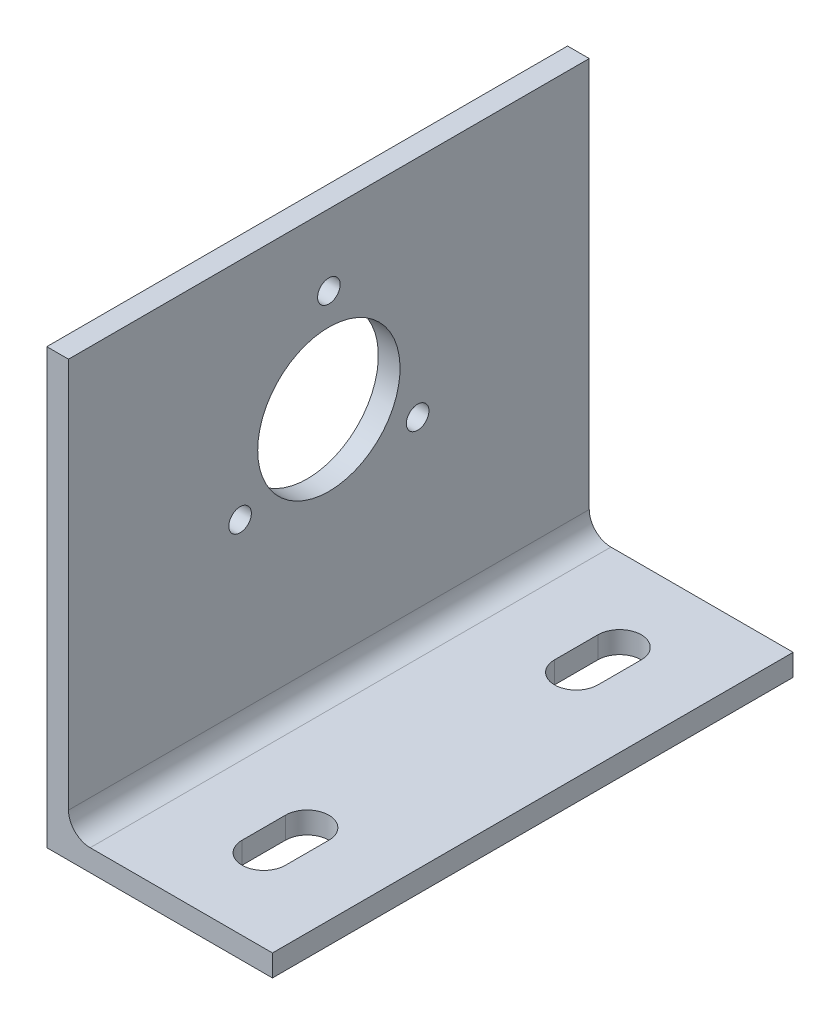
ISO-10303-21;
HEADER;
FILE_DESCRIPTION(('STEP AP214'),'2;1');
FILE_NAME('part.step','',(''),(''),'','','');
FILE_SCHEMA(('AUTOMOTIVE_DESIGN { 1 0 10303 214 1 1 1 1 }'));
ENDSEC;
DATA;
#1=APPLICATION_CONTEXT('core data for automotive mechanical design processes');
#2=APPLICATION_PROTOCOL_DEFINITION('international standard','automotive_design',2000,#1);
#3=PRODUCT_CONTEXT('',#1,'mechanical');
#4=PRODUCT('Part','Part','',(#3));
#5=PRODUCT_RELATED_PRODUCT_CATEGORY('part','',(#4));
#6=PRODUCT_DEFINITION_FORMATION('','',#4);
#7=PRODUCT_DEFINITION_CONTEXT('part definition',#1,'design');
#8=PRODUCT_DEFINITION('design','',#6,#7);
#9=PRODUCT_DEFINITION_SHAPE('','',#8);
#10=(LENGTH_UNIT() NAMED_UNIT(*) SI_UNIT(.MILLI.,.METRE.));
#11=(NAMED_UNIT(*) PLANE_ANGLE_UNIT() SI_UNIT($,.RADIAN.));
#12=(NAMED_UNIT(*) SI_UNIT($,.STERADIAN.) SOLID_ANGLE_UNIT());
#13=UNCERTAINTY_MEASURE_WITH_UNIT(LENGTH_MEASURE(1.E-05),#10,'distance_accuracy_value','');
#14=(GEOMETRIC_REPRESENTATION_CONTEXT(3) GLOBAL_UNCERTAINTY_ASSIGNED_CONTEXT((#13)) GLOBAL_UNIT_ASSIGNED_CONTEXT((#10,
#11,#12)) REPRESENTATION_CONTEXT('',''));
#15=CARTESIAN_POINT('',(0.,0.,0.));
#16=DIRECTION('',(0.,0.,1.));
#17=DIRECTION('',(1.,0.,0.));
#18=AXIS2_PLACEMENT_3D('',#15,#16,#17);
#19=CARTESIAN_POINT('',(101.6,0.,76.2));
#20=DIRECTION('',(0.,1.,0.));
#21=DIRECTION('',(-1.,0.,0.));
#22=AXIS2_PLACEMENT_3D('',#19,#20,#21);
#23=PLANE('',#22);
#24=DIRECTION('',(0.,0.,-1.));
#25=VECTOR('',#24,1.);
#26=CARTESIAN_POINT('',(22.86,0.,12.065));
#27=LINE('',#26,#25);
#28=CARTESIAN_POINT('',(22.86,0.,18.415));
#29=VERTEX_POINT('',#28);
#30=CARTESIAN_POINT('',(22.86,0.,12.065));
#31=VERTEX_POINT('',#30);
#32=EDGE_CURVE('E161',#29,#31,#27,.T.);
#33=ORIENTED_EDGE('',*,*,#32,.T.);
#34=CARTESIAN_POINT('',(19.685,0.,12.065));
#35=DIRECTION('',(0.,1.,0.));
#36=DIRECTION('',(0.,0.,1.));
#37=AXIS2_PLACEMENT_3D('',#34,#35,#36);
#38=CIRCLE('',#37,3.17500000000001);
#39=CARTESIAN_POINT('',(16.51,0.,12.065));
#40=VERTEX_POINT('',#39);
#41=EDGE_CURVE('E152',#31,#40,#38,.T.);
#42=ORIENTED_EDGE('',*,*,#41,.T.);
#43=DIRECTION('',(0.,0.,1.));
#44=VECTOR('',#43,1.);
#45=CARTESIAN_POINT('',(16.51,0.,12.065));
#46=LINE('',#45,#44);
#47=CARTESIAN_POINT('',(16.51,0.,18.415));
#48=VERTEX_POINT('',#47);
#49=EDGE_CURVE('E164',#40,#48,#46,.T.);
#50=ORIENTED_EDGE('',*,*,#49,.T.);
#51=CARTESIAN_POINT('',(19.685,0.,18.415));
#52=DIRECTION('',(0.,1.,0.));
#53=DIRECTION('',(0.,0.,1.));
#54=AXIS2_PLACEMENT_3D('',#51,#52,#53);
#55=CIRCLE('',#54,3.17500000000001);
#56=EDGE_CURVE('E57',#48,#29,#55,.T.);
#57=ORIENTED_EDGE('',*,*,#56,.T.);
#58=EDGE_LOOP('',(#33,#42,#50,#57));
#59=FACE_BOUND('',#58,.T.);
#60=DIRECTION('',(0.,0.,1.));
#61=VECTOR('',#60,1.);
#62=CARTESIAN_POINT('',(16.51,0.,64.135));
#63=LINE('',#62,#61);
#64=CARTESIAN_POINT('',(16.51,0.,57.785));
#65=VERTEX_POINT('',#64);
#66=CARTESIAN_POINT('',(16.51,0.,64.135));
#67=VERTEX_POINT('',#66);
#68=EDGE_CURVE('E206',#65,#67,#63,.T.);
#69=ORIENTED_EDGE('',*,*,#68,.T.);
#70=CARTESIAN_POINT('',(19.685,0.,64.135));
#71=DIRECTION('',(0.,1.,0.));
#72=DIRECTION('',(0.,0.,-1.));
#73=AXIS2_PLACEMENT_3D('',#70,#71,#72);
#74=CIRCLE('',#73,3.17500000000001);
#75=CARTESIAN_POINT('',(22.86,0.,64.135));
#76=VERTEX_POINT('',#75);
#77=EDGE_CURVE('E221',#67,#76,#74,.T.);
#78=ORIENTED_EDGE('',*,*,#77,.T.);
#79=DIRECTION('',(0.,0.,-1.));
#80=VECTOR('',#79,1.);
#81=CARTESIAN_POINT('',(22.86,0.,64.135));
#82=LINE('',#81,#80);
#83=CARTESIAN_POINT('',(22.86,0.,57.785));
#84=VERTEX_POINT('',#83);
#85=EDGE_CURVE('E236',#76,#84,#82,.T.);
#86=ORIENTED_EDGE('',*,*,#85,.T.);
#87=CARTESIAN_POINT('',(19.685,0.,57.785));
#88=DIRECTION('',(0.,1.,0.));
#89=DIRECTION('',(0.,0.,-1.));
#90=AXIS2_PLACEMENT_3D('',#87,#88,#89);
#91=CIRCLE('',#90,3.17500000000001);
#92=EDGE_CURVE('E65',#84,#65,#91,.T.);
#93=ORIENTED_EDGE('',*,*,#92,.T.);
#94=EDGE_LOOP('',(#69,#78,#86,#93));
#95=FACE_BOUND('',#94,.T.);
#96=DIRECTION('',(1.,0.,0.));
#97=VECTOR('',#96,1.);
#98=CARTESIAN_POINT('',(101.6,0.,0.));
#99=LINE('',#98,#97);
#100=CARTESIAN_POINT('',(0.,0.,0.));
#101=VERTEX_POINT('',#100);
#102=CARTESIAN_POINT('',(33.02,0.,0.));
#103=VERTEX_POINT('',#102);
#104=EDGE_CURVE('E288',#101,#103,#99,.T.);
#105=ORIENTED_EDGE('',*,*,#104,.T.);
#106=DIRECTION('',(0.,0.,1.));
#107=VECTOR('',#106,1.);
#108=CARTESIAN_POINT('',(33.02,0.,0.));
#109=LINE('',#108,#107);
#110=CARTESIAN_POINT('',(33.02,0.,76.2));
#111=VERTEX_POINT('',#110);
#112=EDGE_CURVE('E243',#103,#111,#109,.T.);
#113=ORIENTED_EDGE('',*,*,#112,.T.);
#114=DIRECTION('',(1.,0.,0.));
#115=VECTOR('',#114,1.);
#116=CARTESIAN_POINT('',(101.6,0.,76.2));
#117=LINE('',#116,#115);
#118=CARTESIAN_POINT('',(0.,0.,76.2));
#119=VERTEX_POINT('',#118);
#120=EDGE_CURVE('E289',#119,#111,#117,.T.);
#121=ORIENTED_EDGE('',*,*,#120,.F.);
#122=DIRECTION('',(0.,0.,-1.));
#123=VECTOR('',#122,1.);
#124=CARTESIAN_POINT('',(0.,0.,76.2));
#125=LINE('',#124,#123);
#126=EDGE_CURVE('E306',#119,#101,#125,.T.);
#127=ORIENTED_EDGE('',*,*,#126,.T.);
#128=EDGE_LOOP('',(#105,#113,#121,#127));
#129=FACE_BOUND('',#128,.T.);
#130=ADVANCED_FACE('F41',(#59,#95,#129),#23,.F.);
#131=CARTESIAN_POINT('',(3.17500000000001,3.17499999999999,76.2));
#132=DIRECTION('',(0.,-1.,0.));
#133=DIRECTION('',(1.,0.,0.));
#134=AXIS2_PLACEMENT_3D('',#131,#132,#133);
#135=PLANE('',#134);
#136=DIRECTION('',(0.,0.,1.));
#137=VECTOR('',#136,1.);
#138=CARTESIAN_POINT('',(16.51,3.17499999999999,12.065));
#139=LINE('',#138,#137);
#140=CARTESIAN_POINT('',(16.51,3.17499999999999,12.065));
#141=VERTEX_POINT('',#140);
#142=CARTESIAN_POINT('',(16.51,3.17499999999999,18.415));
#143=VERTEX_POINT('',#142);
#144=EDGE_CURVE('E186',#141,#143,#139,.T.);
#145=ORIENTED_EDGE('',*,*,#144,.F.);
#146=CARTESIAN_POINT('',(19.685,3.17499999999999,12.065));
#147=DIRECTION('',(0.,1.,0.));
#148=DIRECTION('',(0.,0.,1.));
#149=AXIS2_PLACEMENT_3D('',#146,#147,#148);
#150=CIRCLE('',#149,3.17500000000001);
#151=CARTESIAN_POINT('',(22.86,3.17499999999999,12.065));
#152=VERTEX_POINT('',#151);
#153=EDGE_CURVE('E155',#152,#141,#150,.T.);
#154=ORIENTED_EDGE('',*,*,#153,.F.);
#155=DIRECTION('',(0.,0.,-1.));
#156=VECTOR('',#155,1.);
#157=CARTESIAN_POINT('',(22.86,3.17499999999999,12.065));
#158=LINE('',#157,#156);
#159=CARTESIAN_POINT('',(22.86,3.17499999999999,18.415));
#160=VERTEX_POINT('',#159);
#161=EDGE_CURVE('E172',#160,#152,#158,.T.);
#162=ORIENTED_EDGE('',*,*,#161,.F.);
#163=CARTESIAN_POINT('',(19.685,3.17499999999999,18.415));
#164=DIRECTION('',(0.,1.,0.));
#165=DIRECTION('',(0.,0.,1.));
#166=AXIS2_PLACEMENT_3D('',#163,#164,#165);
#167=CIRCLE('',#166,3.17500000000001);
#168=EDGE_CURVE('E177',#143,#160,#167,.T.);
#169=ORIENTED_EDGE('',*,*,#168,.F.);
#170=EDGE_LOOP('',(#145,#154,#162,#169));
#171=FACE_BOUND('',#170,.T.);
#172=DIRECTION('',(0.,0.,-1.));
#173=VECTOR('',#172,1.);
#174=CARTESIAN_POINT('',(22.86,3.17499999999999,64.135));
#175=LINE('',#174,#173);
#176=CARTESIAN_POINT('',(22.86,3.17499999999999,64.135));
#177=VERTEX_POINT('',#176);
#178=CARTESIAN_POINT('',(22.86,3.17499999999999,57.785));
#179=VERTEX_POINT('',#178);
#180=EDGE_CURVE('E225',#177,#179,#175,.T.);
#181=ORIENTED_EDGE('',*,*,#180,.F.);
#182=CARTESIAN_POINT('',(19.685,3.17499999999999,64.135));
#183=DIRECTION('',(0.,1.,0.));
#184=DIRECTION('',(0.,0.,-1.));
#185=AXIS2_PLACEMENT_3D('',#182,#183,#184);
#186=CIRCLE('',#185,3.17500000000001);
#187=CARTESIAN_POINT('',(16.51,3.17499999999999,64.135));
#188=VERTEX_POINT('',#187);
#189=EDGE_CURVE('E187',#188,#177,#186,.T.);
#190=ORIENTED_EDGE('',*,*,#189,.F.);
#191=DIRECTION('',(0.,0.,1.));
#192=VECTOR('',#191,1.);
#193=CARTESIAN_POINT('',(16.51,3.17499999999999,64.135));
#194=LINE('',#193,#192);
#195=CARTESIAN_POINT('',(16.51,3.17499999999999,57.785));
#196=VERTEX_POINT('',#195);
#197=EDGE_CURVE('E216',#196,#188,#194,.T.);
#198=ORIENTED_EDGE('',*,*,#197,.F.);
#199=CARTESIAN_POINT('',(19.685,3.17499999999999,57.785));
#200=DIRECTION('',(0.,1.,0.));
#201=DIRECTION('',(0.,0.,-1.));
#202=AXIS2_PLACEMENT_3D('',#199,#200,#201);
#203=CIRCLE('',#202,3.17500000000001);
#204=EDGE_CURVE('E220',#179,#196,#203,.T.);
#205=ORIENTED_EDGE('',*,*,#204,.F.);
#206=EDGE_LOOP('',(#181,#190,#198,#205));
#207=FACE_BOUND('',#206,.T.);
#208=DIRECTION('',(-1.,0.,0.));
#209=VECTOR('',#208,1.);
#210=CARTESIAN_POINT('',(3.17500000000001,3.17499999999999,76.2));
#211=LINE('',#210,#209);
#212=CARTESIAN_POINT('',(33.02,3.17499999999999,76.2));
#213=VERTEX_POINT('',#212);
#214=CARTESIAN_POINT('',(6.35000000000001,3.17499999999999,76.2));
#215=VERTEX_POINT('',#214);
#216=EDGE_CURVE('E293',#213,#215,#211,.T.);
#217=ORIENTED_EDGE('',*,*,#216,.F.);
#218=DIRECTION('',(0.,0.,1.));
#219=VECTOR('',#218,1.);
#220=CARTESIAN_POINT('',(33.02,3.17499999999999,0.));
#221=LINE('',#220,#219);
#222=CARTESIAN_POINT('',(33.02,3.17499999999999,0.));
#223=VERTEX_POINT('',#222);
#224=EDGE_CURVE('E196',#223,#213,#221,.T.);
#225=ORIENTED_EDGE('',*,*,#224,.F.);
#226=DIRECTION('',(-1.,0.,0.));
#227=VECTOR('',#226,1.);
#228=CARTESIAN_POINT('',(3.17500000000001,3.17499999999999,0.));
#229=LINE('',#228,#227);
#230=CARTESIAN_POINT('',(6.35000000000001,3.17499999999999,0.));
#231=VERTEX_POINT('',#230);
#232=EDGE_CURVE('E310',#223,#231,#229,.T.);
#233=ORIENTED_EDGE('',*,*,#232,.T.);
#234=DIRECTION('',(0.,0.,-1.));
#235=VECTOR('',#234,1.);
#236=CARTESIAN_POINT('',(6.35000000000001,3.17499999999999,76.2));
#237=LINE('',#236,#235);
#238=EDGE_CURVE('E336',#231,#215,#237,.F.);
#239=ORIENTED_EDGE('',*,*,#238,.T.);
#240=EDGE_LOOP('',(#217,#225,#233,#239));
#241=FACE_BOUND('',#240,.T.);
#242=ADVANCED_FACE('F354',(#171,#207,#241),#135,.F.);
#243=CARTESIAN_POINT('',(3.175,63.5,76.2));
#244=DIRECTION('',(-1.,0.,0.));
#245=DIRECTION('',(0.,-1.,0.));
#246=AXIS2_PLACEMENT_3D('',#243,#244,#245);
#247=PLANE('',#246);
#248=CARTESIAN_POINT('',(3.175,30.6000000000003,51.0903810567672));
#249=DIRECTION('',(-1.,0.,0.));
#250=DIRECTION('',(0.,-1.,0.));
#251=AXIS2_PLACEMENT_3D('',#248,#249,#250);
#252=CIRCLE('',#251,1.65099999999999);
#253=CARTESIAN_POINT('',(3.175,28.9490000000003,51.0903810567672));
#254=VERTEX_POINT('',#253);
#255=EDGE_CURVE('E284',#254,#254,#252,.T.);
#256=ORIENTED_EDGE('',*,*,#255,.T.);
#257=EDGE_LOOP('',(#256));
#258=FACE_BOUND('',#257,.T.);
#259=CARTESIAN_POINT('',(3.175,30.5999999999998,25.109618943234));
#260=DIRECTION('',(-1.,0.,0.));
#261=DIRECTION('',(0.,-1.,0.));
#262=AXIS2_PLACEMENT_3D('',#259,#260,#261);
#263=CIRCLE('',#262,1.651);
#264=CARTESIAN_POINT('',(3.175,28.9489999999997,25.109618943234));
#265=VERTEX_POINT('',#264);
#266=EDGE_CURVE('E280',#265,#265,#263,.T.);
#267=ORIENTED_EDGE('',*,*,#266,.T.);
#268=EDGE_LOOP('',(#267));
#269=FACE_BOUND('',#268,.T.);
#270=CARTESIAN_POINT('',(3.175,53.1,38.1));
#271=DIRECTION('',(-1.,0.,0.));
#272=DIRECTION('',(0.,-1.,0.));
#273=AXIS2_PLACEMENT_3D('',#270,#271,#272);
#274=CIRCLE('',#273,1.651);
#275=CARTESIAN_POINT('',(3.175,51.449,38.1));
#276=VERTEX_POINT('',#275);
#277=EDGE_CURVE('E276',#276,#276,#274,.T.);
#278=ORIENTED_EDGE('',*,*,#277,.T.);
#279=EDGE_LOOP('',(#278));
#280=FACE_BOUND('',#279,.T.);
#281=CARTESIAN_POINT('',(3.175,38.1,38.1));
#282=DIRECTION('',(-1.,0.,0.));
#283=DIRECTION('',(0.,-1.,0.));
#284=AXIS2_PLACEMENT_3D('',#281,#282,#283);
#285=CIRCLE('',#284,10.414);
#286=CARTESIAN_POINT('',(3.175,27.686,38.1));
#287=VERTEX_POINT('',#286);
#288=EDGE_CURVE('E272',#287,#287,#285,.T.);
#289=ORIENTED_EDGE('',*,*,#288,.T.);
#290=EDGE_LOOP('',(#289));
#291=FACE_BOUND('',#290,.T.);
#292=DIRECTION('',(0.,1.,0.));
#293=VECTOR('',#292,1.);
#294=CARTESIAN_POINT('',(3.175,63.5,76.2));
#295=LINE('',#294,#293);
#296=CARTESIAN_POINT('',(3.17500000000001,6.35,76.2));
#297=VERTEX_POINT('',#296);
#298=CARTESIAN_POINT('',(3.175,63.5,76.2));
#299=VERTEX_POINT('',#298);
#300=EDGE_CURVE('E297',#297,#299,#295,.T.);
#301=ORIENTED_EDGE('',*,*,#300,.F.);
#302=DIRECTION('',(0.,0.,-1.));
#303=VECTOR('',#302,1.);
#304=CARTESIAN_POINT('',(3.17500000000001,6.34999999999999,0.));
#305=LINE('',#304,#303);
#306=CARTESIAN_POINT('',(3.17500000000001,6.35,0.));
#307=VERTEX_POINT('',#306);
#308=EDGE_CURVE('E332',#297,#307,#305,.T.);
#309=ORIENTED_EDGE('',*,*,#308,.T.);
#310=DIRECTION('',(0.,1.,0.));
#311=VECTOR('',#310,1.);
#312=CARTESIAN_POINT('',(3.175,63.5,0.));
#313=LINE('',#312,#311);
#314=CARTESIAN_POINT('',(3.175,63.5,0.));
#315=VERTEX_POINT('',#314);
#316=EDGE_CURVE('E313',#307,#315,#313,.T.);
#317=ORIENTED_EDGE('',*,*,#316,.T.);
#318=DIRECTION('',(0.,0.,-1.));
#319=VECTOR('',#318,1.);
#320=CARTESIAN_POINT('',(3.175,63.5,76.2));
#321=LINE('',#320,#319);
#322=EDGE_CURVE('E328',#299,#315,#321,.T.);
#323=ORIENTED_EDGE('',*,*,#322,.F.);
#324=EDGE_LOOP('',(#301,#309,#317,#323));
#325=FACE_BOUND('',#324,.T.);
#326=ADVANCED_FACE('F375',(#258,#269,#280,#291,#325),#247,.F.);
#327=CARTESIAN_POINT('',(0.,63.5,76.2));
#328=DIRECTION('',(0.,-1.,0.));
#329=DIRECTION('',(0.,0.,-1.));
#330=AXIS2_PLACEMENT_3D('',#327,#328,#329);
#331=PLANE('',#330);
#332=DIRECTION('',(-1.,0.,0.));
#333=VECTOR('',#332,1.);
#334=CARTESIAN_POINT('',(0.,63.5,0.));
#335=LINE('',#334,#333);
#336=CARTESIAN_POINT('',(0.,63.5,0.));
#337=VERTEX_POINT('',#336);
#338=EDGE_CURVE('E316',#315,#337,#335,.T.);
#339=ORIENTED_EDGE('',*,*,#338,.T.);
#340=DIRECTION('',(0.,0.,-1.));
#341=VECTOR('',#340,1.);
#342=CARTESIAN_POINT('',(0.,63.5,76.2));
#343=LINE('',#342,#341);
#344=CARTESIAN_POINT('',(0.,63.5,76.2));
#345=VERTEX_POINT('',#344);
#346=EDGE_CURVE('E324',#345,#337,#343,.T.);
#347=ORIENTED_EDGE('',*,*,#346,.F.);
#348=DIRECTION('',(-1.,0.,0.));
#349=VECTOR('',#348,1.);
#350=CARTESIAN_POINT('',(0.,63.5,76.2));
#351=LINE('',#350,#349);
#352=EDGE_CURVE('E300',#299,#345,#351,.T.);
#353=ORIENTED_EDGE('',*,*,#352,.F.);
#354=ORIENTED_EDGE('',*,*,#322,.T.);
#355=EDGE_LOOP('',(#339,#347,#353,#354));
#356=FACE_BOUND('',#355,.T.);
#357=ADVANCED_FACE('F371',(#356),#331,.F.);
#358=CARTESIAN_POINT('',(0.,0.,76.2));
#359=DIRECTION('',(1.,0.,0.));
#360=DIRECTION('',(0.,0.,-1.));
#361=AXIS2_PLACEMENT_3D('',#358,#359,#360);
#362=PLANE('',#361);
#363=CARTESIAN_POINT('',(0.,30.6000000000003,51.0903810567672));
#364=DIRECTION('',(-1.,0.,0.));
#365=DIRECTION('',(0.,0.,1.));
#366=AXIS2_PLACEMENT_3D('',#363,#364,#365);
#367=CIRCLE('',#366,1.65099999999999);
#368=CARTESIAN_POINT('',(0.,30.6000000000003,52.7413810567672));
#369=VERTEX_POINT('',#368);
#370=EDGE_CURVE('E254',#369,#369,#367,.T.);
#371=ORIENTED_EDGE('',*,*,#370,.F.);
#372=EDGE_LOOP('',(#371));
#373=FACE_BOUND('',#372,.T.);
#374=CARTESIAN_POINT('',(0.,30.5999999999998,25.109618943234));
#375=DIRECTION('',(-1.,0.,0.));
#376=DIRECTION('',(0.,0.,1.));
#377=AXIS2_PLACEMENT_3D('',#374,#375,#376);
#378=CIRCLE('',#377,1.651);
#379=CARTESIAN_POINT('',(0.,30.5999999999998,26.760618943234));
#380=VERTEX_POINT('',#379);
#381=EDGE_CURVE('E262',#380,#380,#378,.T.);
#382=ORIENTED_EDGE('',*,*,#381,.F.);
#383=EDGE_LOOP('',(#382));
#384=FACE_BOUND('',#383,.T.);
#385=CARTESIAN_POINT('',(0.,53.1,38.1));
#386=DIRECTION('',(-1.,0.,0.));
#387=DIRECTION('',(0.,0.,1.));
#388=AXIS2_PLACEMENT_3D('',#385,#386,#387);
#389=CIRCLE('',#388,1.651);
#390=CARTESIAN_POINT('',(0.,53.1,39.751));
#391=VERTEX_POINT('',#390);
#392=EDGE_CURVE('E257',#391,#391,#389,.T.);
#393=ORIENTED_EDGE('',*,*,#392,.F.);
#394=EDGE_LOOP('',(#393));
#395=FACE_BOUND('',#394,.T.);
#396=CARTESIAN_POINT('',(0.,38.1,38.1));
#397=DIRECTION('',(-1.,0.,0.));
#398=DIRECTION('',(0.,0.,1.));
#399=AXIS2_PLACEMENT_3D('',#396,#397,#398);
#400=CIRCLE('',#399,10.414);
#401=CARTESIAN_POINT('',(0.,38.1,48.514));
#402=VERTEX_POINT('',#401);
#403=EDGE_CURVE('E261',#402,#402,#400,.T.);
#404=ORIENTED_EDGE('',*,*,#403,.F.);
#405=EDGE_LOOP('',(#404));
#406=FACE_BOUND('',#405,.T.);
#407=DIRECTION('',(0.,-1.,0.));
#408=VECTOR('',#407,1.);
#409=CARTESIAN_POINT('',(0.,0.,0.));
#410=LINE('',#409,#408);
#411=EDGE_CURVE('E294',#337,#101,#410,.T.);
#412=ORIENTED_EDGE('',*,*,#411,.T.);
#413=ORIENTED_EDGE('',*,*,#126,.F.);
#414=DIRECTION('',(0.,-1.,0.));
#415=VECTOR('',#414,1.);
#416=CARTESIAN_POINT('',(0.,0.,76.2));
#417=LINE('',#416,#415);
#418=EDGE_CURVE('E303',#345,#119,#417,.T.);
#419=ORIENTED_EDGE('',*,*,#418,.F.);
#420=ORIENTED_EDGE('',*,*,#346,.T.);
#421=EDGE_LOOP('',(#412,#413,#419,#420));
#422=FACE_BOUND('',#421,.T.);
#423=ADVANCED_FACE('F367',(#373,#384,#395,#406,#422),#362,.F.);
#424=CARTESIAN_POINT('',(0.,0.,76.2));
#425=DIRECTION('',(0.,0.,-1.));
#426=DIRECTION('',(-1.,0.,0.));
#427=AXIS2_PLACEMENT_3D('',#424,#425,#426);
#428=PLANE('',#427);
#429=ORIENTED_EDGE('',*,*,#120,.T.);
#430=DIRECTION('',(0.,1.,0.));
#431=VECTOR('',#430,1.);
#432=CARTESIAN_POINT('',(33.02,0.,76.2));
#433=LINE('',#432,#431);
#434=EDGE_CURVE('E250',#111,#213,#433,.T.);
#435=ORIENTED_EDGE('',*,*,#434,.T.);
#436=ORIENTED_EDGE('',*,*,#216,.T.);
#437=CARTESIAN_POINT('',(6.35000000000001,6.34999999999999,76.2));
#438=DIRECTION('',(0.,0.,-1.));
#439=DIRECTION('',(-1.,0.,0.));
#440=AXIS2_PLACEMENT_3D('',#437,#438,#439);
#441=CIRCLE('',#440,3.175);
#442=EDGE_CURVE('E11',#215,#297,#441,.T.);
#443=ORIENTED_EDGE('',*,*,#442,.T.);
#444=ORIENTED_EDGE('',*,*,#300,.T.);
#445=ORIENTED_EDGE('',*,*,#352,.T.);
#446=ORIENTED_EDGE('',*,*,#418,.T.);
#447=EDGE_LOOP('',(#429,#435,#436,#443,#444,#445,#446));
#448=FACE_BOUND('',#447,.T.);
#449=ADVANCED_FACE('F359',(#448),#428,.F.);
#450=CARTESIAN_POINT('',(0.,0.,0.));
#451=DIRECTION('',(0.,0.,-1.));
#452=DIRECTION('',(-1.,0.,0.));
#453=AXIS2_PLACEMENT_3D('',#450,#451,#452);
#454=PLANE('',#453);
#455=DIRECTION('',(0.,1.,0.));
#456=VECTOR('',#455,1.);
#457=CARTESIAN_POINT('',(33.02,0.,0.));
#458=LINE('',#457,#456);
#459=EDGE_CURVE('E247',#103,#223,#458,.T.);
#460=ORIENTED_EDGE('',*,*,#459,.F.);
#461=ORIENTED_EDGE('',*,*,#104,.F.);
#462=ORIENTED_EDGE('',*,*,#411,.F.);
#463=ORIENTED_EDGE('',*,*,#338,.F.);
#464=ORIENTED_EDGE('',*,*,#316,.F.);
#465=CARTESIAN_POINT('',(6.35000000000001,6.34999999999999,0.));
#466=DIRECTION('',(0.,0.,-1.));
#467=DIRECTION('',(-1.,0.,0.));
#468=AXIS2_PLACEMENT_3D('',#465,#466,#467);
#469=CIRCLE('',#468,3.175);
#470=EDGE_CURVE('E50',#307,#231,#469,.F.);
#471=ORIENTED_EDGE('',*,*,#470,.T.);
#472=ORIENTED_EDGE('',*,*,#232,.F.);
#473=EDGE_LOOP('',(#460,#461,#462,#463,#464,#471,#472));
#474=FACE_BOUND('',#473,.T.);
#475=ADVANCED_FACE('F347',(#474),#454,.T.);
#476=CARTESIAN_POINT('',(6.35000000000001,6.34999999999999,76.2));
#477=DIRECTION('',(0.,0.,1.));
#478=DIRECTION('',(1.,0.,0.));
#479=AXIS2_PLACEMENT_3D('',#476,#477,#478);
#480=CYLINDRICAL_SURFACE('',#479,3.175);
#481=ORIENTED_EDGE('',*,*,#442,.F.);
#482=ORIENTED_EDGE('',*,*,#238,.F.);
#483=ORIENTED_EDGE('',*,*,#470,.F.);
#484=ORIENTED_EDGE('',*,*,#308,.F.);
#485=EDGE_LOOP('',(#481,#482,#483,#484));
#486=FACE_BOUND('',#485,.T.);
#487=ADVANCED_FACE('F43',(#486),#480,.F.);
#488=CARTESIAN_POINT('',(101.6,38.1,38.1));
#489=DIRECTION('',(-1.,0.,0.));
#490=DIRECTION('',(0.,0.,1.));
#491=AXIS2_PLACEMENT_3D('',#488,#489,#490);
#492=CYLINDRICAL_SURFACE('',#491,10.414);
#493=ORIENTED_EDGE('',*,*,#403,.T.);
#494=EDGE_LOOP('',(#493));
#495=FACE_BOUND('',#494,.T.);
#496=ORIENTED_EDGE('',*,*,#288,.F.);
#497=EDGE_LOOP('',(#496));
#498=FACE_BOUND('',#497,.T.);
#499=ADVANCED_FACE('F524',(#495,#498),#492,.F.);
#500=CARTESIAN_POINT('',(101.6,53.1,38.1));
#501=DIRECTION('',(-1.,0.,0.));
#502=DIRECTION('',(0.,0.,1.));
#503=AXIS2_PLACEMENT_3D('',#500,#501,#502);
#504=CYLINDRICAL_SURFACE('',#503,1.651);
#505=ORIENTED_EDGE('',*,*,#392,.T.);
#506=EDGE_LOOP('',(#505));
#507=FACE_BOUND('',#506,.T.);
#508=ORIENTED_EDGE('',*,*,#277,.F.);
#509=EDGE_LOOP('',(#508));
#510=FACE_BOUND('',#509,.T.);
#511=ADVANCED_FACE('F514',(#507,#510),#504,.F.);
#512=CARTESIAN_POINT('',(101.6,30.5999999999998,25.109618943234));
#513=DIRECTION('',(-1.,0.,0.));
#514=DIRECTION('',(0.,0.,1.));
#515=AXIS2_PLACEMENT_3D('',#512,#513,#514);
#516=CYLINDRICAL_SURFACE('',#515,1.651);
#517=ORIENTED_EDGE('',*,*,#381,.T.);
#518=EDGE_LOOP('',(#517));
#519=FACE_BOUND('',#518,.T.);
#520=ORIENTED_EDGE('',*,*,#266,.F.);
#521=EDGE_LOOP('',(#520));
#522=FACE_BOUND('',#521,.T.);
#523=ADVANCED_FACE('F504',(#519,#522),#516,.F.);
#524=CARTESIAN_POINT('',(101.6,30.6000000000003,51.0903810567672));
#525=DIRECTION('',(-1.,0.,0.));
#526=DIRECTION('',(0.,0.,1.));
#527=AXIS2_PLACEMENT_3D('',#524,#525,#526);
#528=CYLINDRICAL_SURFACE('',#527,1.65099999999999);
#529=ORIENTED_EDGE('',*,*,#370,.T.);
#530=EDGE_LOOP('',(#529));
#531=FACE_BOUND('',#530,.T.);
#532=ORIENTED_EDGE('',*,*,#255,.F.);
#533=EDGE_LOOP('',(#532));
#534=FACE_BOUND('',#533,.T.);
#535=ADVANCED_FACE('F496',(#531,#534),#528,.F.);
#536=CARTESIAN_POINT('',(33.02,0.,0.));
#537=DIRECTION('',(-1.,0.,0.));
#538=DIRECTION('',(0.,0.,1.));
#539=AXIS2_PLACEMENT_3D('',#536,#537,#538);
#540=PLANE('',#539);
#541=ORIENTED_EDGE('',*,*,#224,.T.);
#542=ORIENTED_EDGE('',*,*,#434,.F.);
#543=ORIENTED_EDGE('',*,*,#112,.F.);
#544=ORIENTED_EDGE('',*,*,#459,.T.);
#545=EDGE_LOOP('',(#541,#542,#543,#544));
#546=FACE_BOUND('',#545,.T.);
#547=ADVANCED_FACE('F357',(#546),#540,.F.);
#548=CARTESIAN_POINT('',(19.685,0.,64.135));
#549=DIRECTION('',(0.,1.,0.));
#550=DIRECTION('',(0.,0.,1.));
#551=AXIS2_PLACEMENT_3D('',#548,#549,#550);
#552=CYLINDRICAL_SURFACE('',#551,3.17500000000001);
#553=ORIENTED_EDGE('',*,*,#189,.T.);
#554=DIRECTION('',(0.,1.,0.));
#555=VECTOR('',#554,1.);
#556=CARTESIAN_POINT('',(22.86,0.,64.135));
#557=LINE('',#556,#555);
#558=EDGE_CURVE('E202',#76,#177,#557,.T.);
#559=ORIENTED_EDGE('',*,*,#558,.F.);
#560=ORIENTED_EDGE('',*,*,#77,.F.);
#561=DIRECTION('',(0.,1.,0.));
#562=VECTOR('',#561,1.);
#563=CARTESIAN_POINT('',(16.51,0.,64.135));
#564=LINE('',#563,#562);
#565=EDGE_CURVE('E213',#67,#188,#564,.T.);
#566=ORIENTED_EDGE('',*,*,#565,.T.);
#567=EDGE_LOOP('',(#553,#559,#560,#566));
#568=FACE_BOUND('',#567,.T.);
#569=ADVANCED_FACE('F402',(#568),#552,.F.);
#570=CARTESIAN_POINT('',(16.51,0.,64.135));
#571=DIRECTION('',(-1.,0.,0.));
#572=DIRECTION('',(0.,0.,1.));
#573=AXIS2_PLACEMENT_3D('',#570,#571,#572);
#574=PLANE('',#573);
#575=ORIENTED_EDGE('',*,*,#197,.T.);
#576=ORIENTED_EDGE('',*,*,#565,.F.);
#577=ORIENTED_EDGE('',*,*,#68,.F.);
#578=DIRECTION('',(0.,1.,0.));
#579=VECTOR('',#578,1.);
#580=CARTESIAN_POINT('',(16.51,0.,57.785));
#581=LINE('',#580,#579);
#582=EDGE_CURVE('E210',#65,#196,#581,.T.);
#583=ORIENTED_EDGE('',*,*,#582,.T.);
#584=EDGE_LOOP('',(#575,#576,#577,#583));
#585=FACE_BOUND('',#584,.T.);
#586=ADVANCED_FACE('F407',(#585),#574,.F.);
#587=CARTESIAN_POINT('',(19.685,0.,57.785));
#588=DIRECTION('',(0.,1.,0.));
#589=DIRECTION('',(0.,0.,1.));
#590=AXIS2_PLACEMENT_3D('',#587,#588,#589);
#591=CYLINDRICAL_SURFACE('',#590,3.17500000000001);
#592=ORIENTED_EDGE('',*,*,#204,.T.);
#593=ORIENTED_EDGE('',*,*,#582,.F.);
#594=ORIENTED_EDGE('',*,*,#92,.F.);
#595=DIRECTION('',(0.,1.,0.));
#596=VECTOR('',#595,1.);
#597=CARTESIAN_POINT('',(22.86,0.,57.785));
#598=LINE('',#597,#596);
#599=EDGE_CURVE('E207',#84,#179,#598,.T.);
#600=ORIENTED_EDGE('',*,*,#599,.T.);
#601=EDGE_LOOP('',(#592,#593,#594,#600));
#602=FACE_BOUND('',#601,.T.);
#603=ADVANCED_FACE('F420',(#602),#591,.F.);
#604=CARTESIAN_POINT('',(22.86,0.,64.135));
#605=DIRECTION('',(1.,0.,0.));
#606=DIRECTION('',(0.,0.,-1.));
#607=AXIS2_PLACEMENT_3D('',#604,#605,#606);
#608=PLANE('',#607);
#609=ORIENTED_EDGE('',*,*,#180,.T.);
#610=ORIENTED_EDGE('',*,*,#599,.F.);
#611=ORIENTED_EDGE('',*,*,#85,.F.);
#612=ORIENTED_EDGE('',*,*,#558,.T.);
#613=EDGE_LOOP('',(#609,#610,#611,#612));
#614=FACE_BOUND('',#613,.T.);
#615=ADVANCED_FACE('F431',(#614),#608,.F.);
#616=CARTESIAN_POINT('',(19.685,0.,12.065));
#617=DIRECTION('',(0.,1.,0.));
#618=DIRECTION('',(0.,0.,1.));
#619=AXIS2_PLACEMENT_3D('',#616,#617,#618);
#620=CYLINDRICAL_SURFACE('',#619,3.17500000000001);
#621=ORIENTED_EDGE('',*,*,#153,.T.);
#622=DIRECTION('',(0.,1.,0.));
#623=VECTOR('',#622,1.);
#624=CARTESIAN_POINT('',(16.51,0.,12.065));
#625=LINE('',#624,#623);
#626=EDGE_CURVE('E148',#40,#141,#625,.T.);
#627=ORIENTED_EDGE('',*,*,#626,.F.);
#628=ORIENTED_EDGE('',*,*,#41,.F.);
#629=DIRECTION('',(0.,1.,0.));
#630=VECTOR('',#629,1.);
#631=CARTESIAN_POINT('',(22.86,0.,12.065));
#632=LINE('',#631,#630);
#633=EDGE_CURVE('E193',#31,#152,#632,.T.);
#634=ORIENTED_EDGE('',*,*,#633,.T.);
#635=EDGE_LOOP('',(#621,#627,#628,#634));
#636=FACE_BOUND('',#635,.T.);
#637=ADVANCED_FACE('F150',(#636),#620,.F.);
#638=CARTESIAN_POINT('',(22.86,0.,12.065));
#639=DIRECTION('',(1.,0.,0.));
#640=DIRECTION('',(0.,0.,-1.));
#641=AXIS2_PLACEMENT_3D('',#638,#639,#640);
#642=PLANE('',#641);
#643=ORIENTED_EDGE('',*,*,#161,.T.);
#644=ORIENTED_EDGE('',*,*,#633,.F.);
#645=ORIENTED_EDGE('',*,*,#32,.F.);
#646=DIRECTION('',(0.,1.,0.));
#647=VECTOR('',#646,1.);
#648=CARTESIAN_POINT('',(22.86,0.,18.415));
#649=LINE('',#648,#647);
#650=EDGE_CURVE('E197',#29,#160,#649,.T.);
#651=ORIENTED_EDGE('',*,*,#650,.T.);
#652=EDGE_LOOP('',(#643,#644,#645,#651));
#653=FACE_BOUND('',#652,.T.);
#654=ADVANCED_FACE('F451',(#653),#642,.F.);
#655=CARTESIAN_POINT('',(19.685,0.,18.415));
#656=DIRECTION('',(0.,1.,0.));
#657=DIRECTION('',(0.,0.,1.));
#658=AXIS2_PLACEMENT_3D('',#655,#656,#657);
#659=CYLINDRICAL_SURFACE('',#658,3.17500000000001);
#660=ORIENTED_EDGE('',*,*,#168,.T.);
#661=ORIENTED_EDGE('',*,*,#650,.F.);
#662=ORIENTED_EDGE('',*,*,#56,.F.);
#663=DIRECTION('',(0.,1.,0.));
#664=VECTOR('',#663,1.);
#665=CARTESIAN_POINT('',(16.51,0.,18.415));
#666=LINE('',#665,#664);
#667=EDGE_CURVE('E160',#48,#143,#666,.T.);
#668=ORIENTED_EDGE('',*,*,#667,.T.);
#669=EDGE_LOOP('',(#660,#661,#662,#668));
#670=FACE_BOUND('',#669,.T.);
#671=ADVANCED_FACE('F461',(#670),#659,.F.);
#672=CARTESIAN_POINT('',(16.51,0.,12.065));
#673=DIRECTION('',(-1.,0.,0.));
#674=DIRECTION('',(0.,0.,1.));
#675=AXIS2_PLACEMENT_3D('',#672,#673,#674);
#676=PLANE('',#675);
#677=ORIENTED_EDGE('',*,*,#144,.T.);
#678=ORIENTED_EDGE('',*,*,#667,.F.);
#679=ORIENTED_EDGE('',*,*,#49,.F.);
#680=ORIENTED_EDGE('',*,*,#626,.T.);
#681=EDGE_LOOP('',(#677,#678,#679,#680));
#682=FACE_BOUND('',#681,.T.);
#683=ADVANCED_FACE('F165',(#682),#676,.F.);
#684=CLOSED_SHELL('',(#130,#242,#326,#357,#423,#449,#475,#487,#499,#511,#523,#535,#547,#569,
#586,#603,#615,#637,#654,#671,#683));
#685=MANIFOLD_SOLID_BREP('B2',#684);
#686=ADVANCED_BREP_SHAPE_REPRESENTATION('',(#18,#685),#14);
#687=SHAPE_DEFINITION_REPRESENTATION(#9,#686);
ENDSEC;
END-ISO-10303-21;
